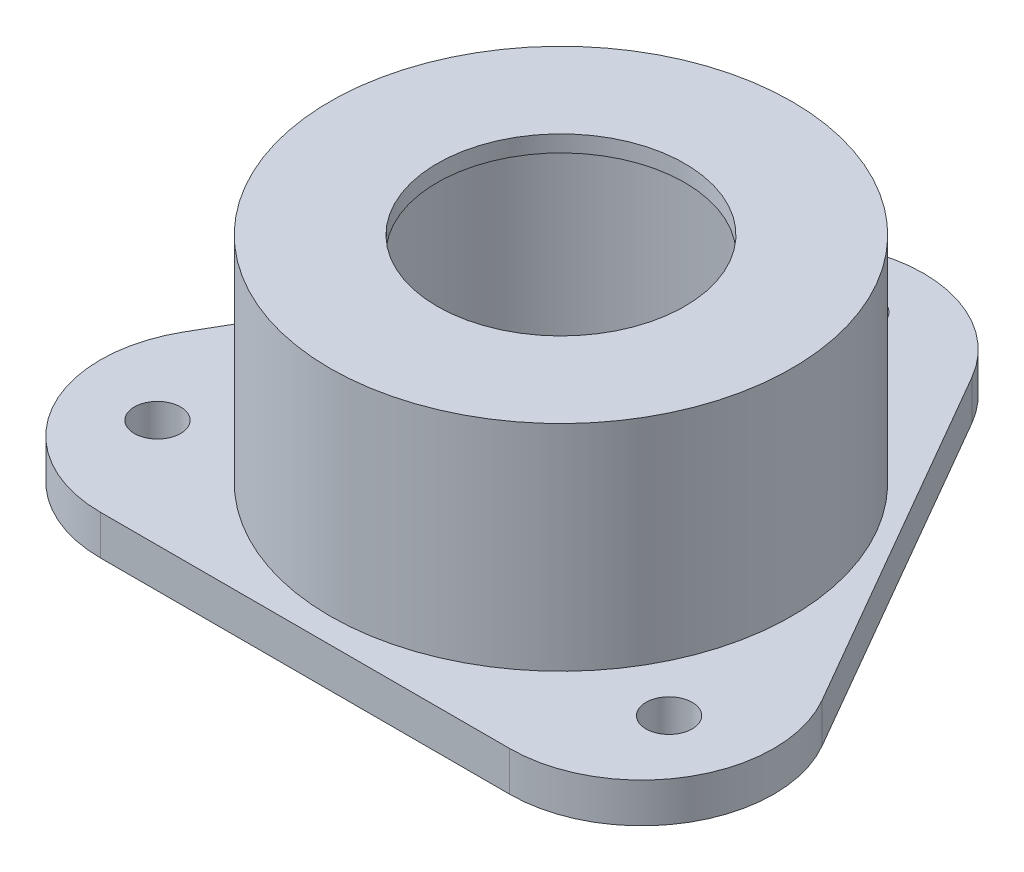
ISO-10303-21;
HEADER;
FILE_DESCRIPTION(('STEP AP214'),'2;1');
FILE_NAME('part.step','',(''),(''),'','','');
FILE_SCHEMA(('AUTOMOTIVE_DESIGN { 1 0 10303 214 1 1 1 1 }'));
ENDSEC;
DATA;
#1=APPLICATION_CONTEXT('core data for automotive mechanical design processes');
#2=APPLICATION_PROTOCOL_DEFINITION('international standard','automotive_design',2000,#1);
#3=PRODUCT_CONTEXT('',#1,'mechanical');
#4=PRODUCT('Part','Part','',(#3));
#5=PRODUCT_RELATED_PRODUCT_CATEGORY('part','',(#4));
#6=PRODUCT_DEFINITION_FORMATION('','',#4);
#7=PRODUCT_DEFINITION_CONTEXT('part definition',#1,'design');
#8=PRODUCT_DEFINITION('design','',#6,#7);
#9=PRODUCT_DEFINITION_SHAPE('','',#8);
#10=(LENGTH_UNIT() NAMED_UNIT(*) SI_UNIT(.MILLI.,.METRE.));
#11=(NAMED_UNIT(*) PLANE_ANGLE_UNIT() SI_UNIT($,.RADIAN.));
#12=(NAMED_UNIT(*) SI_UNIT($,.STERADIAN.) SOLID_ANGLE_UNIT());
#13=UNCERTAINTY_MEASURE_WITH_UNIT(LENGTH_MEASURE(1.E-05),#10,'distance_accuracy_value','');
#14=(GEOMETRIC_REPRESENTATION_CONTEXT(3) GLOBAL_UNCERTAINTY_ASSIGNED_CONTEXT((#13)) GLOBAL_UNIT_ASSIGNED_CONTEXT((#10,
#11,#12)) REPRESENTATION_CONTEXT('',''));
#15=CARTESIAN_POINT('',(0.,0.,0.));
#16=DIRECTION('',(0.,0.,1.));
#17=DIRECTION('',(1.,0.,0.));
#18=AXIS2_PLACEMENT_3D('',#15,#16,#17);
#19=CARTESIAN_POINT('',(32.0049681464521,-10.,4.75209437780733));
#20=DIRECTION('',(0.,1.,0.));
#21=DIRECTION('',(0.,0.,1.));
#22=AXIS2_PLACEMENT_3D('',#19,#20,#21);
#23=CYLINDRICAL_SURFACE('',#22,37.5);
#24=CARTESIAN_POINT('',(32.0049681464521,77.,4.75209437780733));
#25=DIRECTION('',(0.,1.,0.));
#26=DIRECTION('',(0.,0.,1.));
#27=AXIS2_PLACEMENT_3D('',#24,#25,#26);
#28=CIRCLE('',#27,37.5);
#29=CARTESIAN_POINT('',(32.0049681464521,77.,42.2520943778073));
#30=VERTEX_POINT('',#29);
#31=EDGE_CURVE('E148',#30,#30,#28,.T.);
#32=ORIENTED_EDGE('',*,*,#31,.T.);
#33=EDGE_LOOP('',(#32));
#34=FACE_BOUND('',#33,.T.);
#35=CARTESIAN_POINT('',(32.0049681464521,72.,4.75209437780733));
#36=DIRECTION('',(0.,-1.,0.));
#37=DIRECTION('',(0.,0.,-1.));
#38=AXIS2_PLACEMENT_3D('',#35,#36,#37);
#39=CIRCLE('',#38,37.5);
#40=CARTESIAN_POINT('',(32.0049681464521,72.,-32.7479056221927));
#41=VERTEX_POINT('',#40);
#42=EDGE_CURVE('E37',#41,#41,#39,.F.);
#43=ORIENTED_EDGE('',*,*,#42,.F.);
#44=EDGE_LOOP('',(#43));
#45=FACE_BOUND('',#44,.T.);
#46=ADVANCED_FACE('F33',(#34,#45),#23,.F.);
#47=CARTESIAN_POINT('',(32.0049681464521,12.,-65.104941493052));
#48=DIRECTION('',(0.,-1.,0.));
#49=DIRECTION('',(0.,0.,-1.));
#50=AXIS2_PLACEMENT_3D('',#47,#48,#49);
#51=CYLINDRICAL_SURFACE('',#50,40.);
#52=CARTESIAN_POINT('',(32.0049681464521,0.,-65.104941493052));
#53=DIRECTION('',(0.,1.,0.));
#54=DIRECTION('',(0.,0.,1.));
#55=AXIS2_PLACEMENT_3D('',#52,#53,#54);
#56=CIRCLE('',#55,40.);
#57=CARTESIAN_POINT('',(66.6459842978296,0.,-85.104941493052));
#58=VERTEX_POINT('',#57);
#59=CARTESIAN_POINT('',(-2.63604800492546,0.,-85.104941493052));
#60=VERTEX_POINT('',#59);
#61=EDGE_CURVE('E121',#58,#60,#56,.T.);
#62=ORIENTED_EDGE('',*,*,#61,.T.);
#63=DIRECTION('',(0.,-1.,0.));
#64=VECTOR('',#63,1.);
#65=CARTESIAN_POINT('',(-2.63604800492546,12.,-85.104941493052));
#66=LINE('',#65,#64);
#67=CARTESIAN_POINT('',(-2.63604800492546,12.,-85.104941493052));
#68=VERTEX_POINT('',#67);
#69=EDGE_CURVE('E43',#68,#60,#66,.T.);
#70=ORIENTED_EDGE('',*,*,#69,.F.);
#71=CARTESIAN_POINT('',(32.0049681464521,12.,-65.104941493052));
#72=DIRECTION('',(0.,1.,0.));
#73=DIRECTION('',(0.,0.,1.));
#74=AXIS2_PLACEMENT_3D('',#71,#72,#73);
#75=CIRCLE('',#74,40.);
#76=CARTESIAN_POINT('',(66.6459842978296,12.,-85.104941493052));
#77=VERTEX_POINT('',#76);
#78=EDGE_CURVE('E132',#77,#68,#75,.T.);
#79=ORIENTED_EDGE('',*,*,#78,.F.);
#80=DIRECTION('',(0.,-1.,0.));
#81=VECTOR('',#80,1.);
#82=CARTESIAN_POINT('',(66.6459842978296,12.,-85.104941493052));
#83=LINE('',#82,#81);
#84=EDGE_CURVE('E117',#77,#58,#83,.T.);
#85=ORIENTED_EDGE('',*,*,#84,.T.);
#86=EDGE_LOOP('',(#62,#70,#79,#85));
#87=FACE_BOUND('',#86,.T.);
#88=ADVANCED_FACE('F35',(#87),#51,.T.);
#89=CARTESIAN_POINT('',(-64.6340157021704,12.,22.2786885245903));
#90=DIRECTION('',(0.866025403784439,0.,0.5));
#91=DIRECTION('',(0.5,0.,-0.866025403784439));
#92=AXIS2_PLACEMENT_3D('',#89,#90,#91);
#93=PLANE('',#92);
#94=DIRECTION('',(-0.5,0.,0.866025403784439));
#95=VECTOR('',#94,1.);
#96=CARTESIAN_POINT('',(-64.6340157021704,0.,22.2786885245903));
#97=LINE('',#96,#95);
#98=CARTESIAN_POINT('',(-64.6340157021704,0.,22.2786885245903));
#99=VERTEX_POINT('',#98);
#100=EDGE_CURVE('E124',#60,#99,#97,.T.);
#101=ORIENTED_EDGE('',*,*,#100,.T.);
#102=DIRECTION('',(0.,-1.,0.));
#103=VECTOR('',#102,1.);
#104=CARTESIAN_POINT('',(-64.6340157021704,12.,22.2786885245903));
#105=LINE('',#104,#103);
#106=CARTESIAN_POINT('',(-64.6340157021704,12.,22.2786885245903));
#107=VERTEX_POINT('',#106);
#108=EDGE_CURVE('E136',#107,#99,#105,.T.);
#109=ORIENTED_EDGE('',*,*,#108,.F.);
#110=DIRECTION('',(-0.5,0.,0.866025403784439));
#111=VECTOR('',#110,1.);
#112=CARTESIAN_POINT('',(-64.6340157021704,12.,22.2786885245903));
#113=LINE('',#112,#111);
#114=EDGE_CURVE('E90',#68,#107,#113,.T.);
#115=ORIENTED_EDGE('',*,*,#114,.F.);
#116=ORIENTED_EDGE('',*,*,#69,.T.);
#117=EDGE_LOOP('',(#101,#109,#115,#116));
#118=FACE_BOUND('',#117,.T.);
#119=ADVANCED_FACE('F178',(#118),#93,.F.);
#120=CARTESIAN_POINT('',(-29.9929995507928,12.,42.2786885245903));
#121=DIRECTION('',(0.,-1.,0.));
#122=DIRECTION('',(0.,0.,-1.));
#123=AXIS2_PLACEMENT_3D('',#120,#121,#122);
#124=CYLINDRICAL_SURFACE('',#123,40.);
#125=CARTESIAN_POINT('',(-29.9929995507928,0.,42.2786885245903));
#126=DIRECTION('',(0.,1.,0.));
#127=DIRECTION('',(0.,0.,-1.));
#128=AXIS2_PLACEMENT_3D('',#125,#126,#127);
#129=CIRCLE('',#128,40.);
#130=CARTESIAN_POINT('',(-29.9929995507928,0.,82.2786885245903));
#131=VERTEX_POINT('',#130);
#132=EDGE_CURVE('E127',#99,#131,#129,.T.);
#133=ORIENTED_EDGE('',*,*,#132,.T.);
#134=DIRECTION('',(0.,-1.,0.));
#135=VECTOR('',#134,1.);
#136=CARTESIAN_POINT('',(-29.9929995507928,12.,82.2786885245903));
#137=LINE('',#136,#135);
#138=CARTESIAN_POINT('',(-29.9929995507928,12.,82.2786885245903));
#139=VERTEX_POINT('',#138);
#140=EDGE_CURVE('E112',#139,#131,#137,.T.);
#141=ORIENTED_EDGE('',*,*,#140,.F.);
#142=CARTESIAN_POINT('',(-29.9929995507928,12.,42.2786885245903));
#143=DIRECTION('',(0.,1.,0.));
#144=DIRECTION('',(0.,0.,-1.));
#145=AXIS2_PLACEMENT_3D('',#142,#143,#144);
#146=CIRCLE('',#145,40.);
#147=EDGE_CURVE('E103',#107,#139,#146,.T.);
#148=ORIENTED_EDGE('',*,*,#147,.F.);
#149=ORIENTED_EDGE('',*,*,#108,.T.);
#150=EDGE_LOOP('',(#133,#141,#148,#149));
#151=FACE_BOUND('',#150,.T.);
#152=ADVANCED_FACE('F181',(#151),#124,.T.);
#153=CARTESIAN_POINT('',(94.002935843697,12.,82.2786885245903));
#154=DIRECTION('',(0.,0.,-1.));
#155=DIRECTION('',(-1.,0.,0.));
#156=AXIS2_PLACEMENT_3D('',#153,#154,#155);
#157=PLANE('',#156);
#158=DIRECTION('',(1.,0.,0.));
#159=VECTOR('',#158,1.);
#160=CARTESIAN_POINT('',(94.002935843697,0.,82.2786885245903));
#161=LINE('',#160,#159);
#162=CARTESIAN_POINT('',(94.002935843697,0.,82.2786885245903));
#163=VERTEX_POINT('',#162);
#164=EDGE_CURVE('E111',#131,#163,#161,.T.);
#165=ORIENTED_EDGE('',*,*,#164,.T.);
#166=DIRECTION('',(0.,-1.,0.));
#167=VECTOR('',#166,1.);
#168=CARTESIAN_POINT('',(94.002935843697,12.,82.2786885245903));
#169=LINE('',#168,#167);
#170=CARTESIAN_POINT('',(94.002935843697,12.,82.2786885245903));
#171=VERTEX_POINT('',#170);
#172=EDGE_CURVE('E108',#171,#163,#169,.T.);
#173=ORIENTED_EDGE('',*,*,#172,.F.);
#174=DIRECTION('',(1.,0.,0.));
#175=VECTOR('',#174,1.);
#176=CARTESIAN_POINT('',(94.002935843697,12.,82.2786885245903));
#177=LINE('',#176,#175);
#178=EDGE_CURVE('E97',#139,#171,#177,.T.);
#179=ORIENTED_EDGE('',*,*,#178,.F.);
#180=ORIENTED_EDGE('',*,*,#140,.T.);
#181=EDGE_LOOP('',(#165,#173,#179,#180));
#182=FACE_BOUND('',#181,.T.);
#183=ADVANCED_FACE('F109',(#182),#157,.F.);
#184=CARTESIAN_POINT('',(94.002935843697,12.,42.2786885245902));
#185=DIRECTION('',(0.,-1.,0.));
#186=DIRECTION('',(0.,0.,-1.));
#187=AXIS2_PLACEMENT_3D('',#184,#185,#186);
#188=CYLINDRICAL_SURFACE('',#187,40.);
#189=CARTESIAN_POINT('',(94.002935843697,0.,42.2786885245902));
#190=DIRECTION('',(0.,1.,0.));
#191=DIRECTION('',(0.,0.,-1.));
#192=AXIS2_PLACEMENT_3D('',#189,#190,#191);
#193=CIRCLE('',#192,40.);
#194=CARTESIAN_POINT('',(128.643951995075,0.,22.2786885245902));
#195=VERTEX_POINT('',#194);
#196=EDGE_CURVE('E75',#163,#195,#193,.T.);
#197=ORIENTED_EDGE('',*,*,#196,.T.);
#198=DIRECTION('',(0.,-1.,0.));
#199=VECTOR('',#198,1.);
#200=CARTESIAN_POINT('',(128.643951995075,12.,22.2786885245902));
#201=LINE('',#200,#199);
#202=CARTESIAN_POINT('',(128.643951995075,12.,22.2786885245902));
#203=VERTEX_POINT('',#202);
#204=EDGE_CURVE('E113',#203,#195,#201,.T.);
#205=ORIENTED_EDGE('',*,*,#204,.F.);
#206=CARTESIAN_POINT('',(94.002935843697,12.,42.2786885245902));
#207=DIRECTION('',(0.,1.,0.));
#208=DIRECTION('',(0.,0.,-1.));
#209=AXIS2_PLACEMENT_3D('',#206,#207,#208);
#210=CIRCLE('',#209,40.);
#211=EDGE_CURVE('E101',#171,#203,#210,.T.);
#212=ORIENTED_EDGE('',*,*,#211,.F.);
#213=ORIENTED_EDGE('',*,*,#172,.T.);
#214=EDGE_LOOP('',(#197,#205,#212,#213));
#215=FACE_BOUND('',#214,.T.);
#216=ADVANCED_FACE('F115',(#215),#188,.T.);
#217=CARTESIAN_POINT('',(66.6459842978296,12.,-85.104941493052));
#218=DIRECTION('',(-0.866025403784439,0.,0.5));
#219=DIRECTION('',(0.5,0.,0.866025403784439));
#220=AXIS2_PLACEMENT_3D('',#217,#218,#219);
#221=PLANE('',#220);
#222=DIRECTION('',(-0.5,0.,-0.866025403784439));
#223=VECTOR('',#222,1.);
#224=CARTESIAN_POINT('',(66.6459842978296,0.,-85.104941493052));
#225=LINE('',#224,#223);
#226=EDGE_CURVE('E81',#195,#58,#225,.T.);
#227=ORIENTED_EDGE('',*,*,#226,.T.);
#228=ORIENTED_EDGE('',*,*,#84,.F.);
#229=DIRECTION('',(-0.5,0.,-0.866025403784439));
#230=VECTOR('',#229,1.);
#231=CARTESIAN_POINT('',(66.6459842978296,12.,-85.104941493052));
#232=LINE('',#231,#230);
#233=EDGE_CURVE('E52',#203,#77,#232,.T.);
#234=ORIENTED_EDGE('',*,*,#233,.F.);
#235=ORIENTED_EDGE('',*,*,#204,.T.);
#236=EDGE_LOOP('',(#227,#228,#234,#235));
#237=FACE_BOUND('',#236,.T.);
#238=ADVANCED_FACE('F186',(#237),#221,.F.);
#239=CARTESIAN_POINT('',(32.0049681464521,12.,-65.104941493052));
#240=DIRECTION('',(0.,1.,0.));
#241=DIRECTION('',(0.,0.,1.));
#242=AXIS2_PLACEMENT_3D('',#239,#240,#241);
#243=PLANE('',#242);
#244=CARTESIAN_POINT('',(32.0049681464521,12.,4.75209437780733));
#245=DIRECTION('',(0.,1.,0.));
#246=DIRECTION('',(0.,0.,1.));
#247=AXIS2_PLACEMENT_3D('',#244,#245,#246);
#248=CIRCLE('',#247,70.);
#249=CARTESIAN_POINT('',(32.0049681464521,12.,74.7520943778074));
#250=VERTEX_POINT('',#249);
#251=EDGE_CURVE('E11',#250,#250,#248,.T.);
#252=ORIENTED_EDGE('',*,*,#251,.F.);
#253=EDGE_LOOP('',(#252));
#254=FACE_BOUND('',#253,.T.);
#255=CARTESIAN_POINT('',(109.504968146452,12.,49.4967402400033));
#256=DIRECTION('',(0.,1.,0.));
#257=DIRECTION('',(0.,0.,1.));
#258=AXIS2_PLACEMENT_3D('',#255,#256,#257);
#259=CIRCLE('',#258,7.);
#260=CARTESIAN_POINT('',(109.504968146452,12.,56.4967402400033));
#261=VERTEX_POINT('',#260);
#262=EDGE_CURVE('E144',#261,#261,#259,.T.);
#263=ORIENTED_EDGE('',*,*,#262,.F.);
#264=EDGE_LOOP('',(#263));
#265=FACE_BOUND('',#264,.T.);
#266=CARTESIAN_POINT('',(32.0049681464521,12.,-84.7371973465846));
#267=DIRECTION('',(0.,1.,0.));
#268=DIRECTION('',(0.,0.,1.));
#269=AXIS2_PLACEMENT_3D('',#266,#267,#268);
#270=CIRCLE('',#269,7.);
#271=CARTESIAN_POINT('',(32.0049681464521,12.,-77.7371973465846));
#272=VERTEX_POINT('',#271);
#273=EDGE_CURVE('E170',#272,#272,#270,.T.);
#274=ORIENTED_EDGE('',*,*,#273,.F.);
#275=EDGE_LOOP('',(#274));
#276=FACE_BOUND('',#275,.T.);
#277=CARTESIAN_POINT('',(-45.4950318535479,12.,49.4967402400033));
#278=DIRECTION('',(0.,1.,0.));
#279=DIRECTION('',(0.,0.,1.));
#280=AXIS2_PLACEMENT_3D('',#277,#278,#279);
#281=CIRCLE('',#280,7.);
#282=CARTESIAN_POINT('',(-45.4950318535479,12.,56.4967402400033));
#283=VERTEX_POINT('',#282);
#284=EDGE_CURVE('E154',#283,#283,#281,.T.);
#285=ORIENTED_EDGE('',*,*,#284,.F.);
#286=EDGE_LOOP('',(#285));
#287=FACE_BOUND('',#286,.T.);
#288=ORIENTED_EDGE('',*,*,#78,.T.);
#289=ORIENTED_EDGE('',*,*,#114,.T.);
#290=ORIENTED_EDGE('',*,*,#147,.T.);
#291=ORIENTED_EDGE('',*,*,#178,.T.);
#292=ORIENTED_EDGE('',*,*,#211,.T.);
#293=ORIENTED_EDGE('',*,*,#233,.T.);
#294=EDGE_LOOP('',(#288,#289,#290,#291,#292,#293));
#295=FACE_BOUND('',#294,.T.);
#296=ADVANCED_FACE('F99',(#254,#265,#276,#287,#295),#243,.T.);
#297=CARTESIAN_POINT('',(32.0049681464521,0.,-65.104941493052));
#298=DIRECTION('',(0.,1.,0.));
#299=DIRECTION('',(0.,0.,1.));
#300=AXIS2_PLACEMENT_3D('',#297,#298,#299);
#301=PLANE('',#300);
#302=CARTESIAN_POINT('',(32.0049681464521,0.,4.75209437780733));
#303=DIRECTION('',(0.,-1.,0.));
#304=DIRECTION('',(0.,0.,-1.));
#305=AXIS2_PLACEMENT_3D('',#302,#303,#304);
#306=CIRCLE('',#305,55.);
#307=CARTESIAN_POINT('',(32.0049681464521,0.,-50.2479056221927));
#308=VERTEX_POINT('',#307);
#309=EDGE_CURVE('E161',#308,#308,#306,.T.);
#310=ORIENTED_EDGE('',*,*,#309,.F.);
#311=EDGE_LOOP('',(#310));
#312=FACE_BOUND('',#311,.T.);
#313=CARTESIAN_POINT('',(109.504968146452,0.,49.4967402400033));
#314=DIRECTION('',(0.,1.,0.));
#315=DIRECTION('',(0.,0.,1.));
#316=AXIS2_PLACEMENT_3D('',#313,#314,#315);
#317=CIRCLE('',#316,7.);
#318=CARTESIAN_POINT('',(109.504968146452,0.,56.4967402400033));
#319=VERTEX_POINT('',#318);
#320=EDGE_CURVE('E125',#319,#319,#317,.T.);
#321=ORIENTED_EDGE('',*,*,#320,.T.);
#322=EDGE_LOOP('',(#321));
#323=FACE_BOUND('',#322,.T.);
#324=CARTESIAN_POINT('',(32.0049681464521,0.,-84.7371973465846));
#325=DIRECTION('',(0.,1.,0.));
#326=DIRECTION('',(0.,0.,1.));
#327=AXIS2_PLACEMENT_3D('',#324,#325,#326);
#328=CIRCLE('',#327,7.);
#329=CARTESIAN_POINT('',(32.0049681464521,0.,-77.7371973465846));
#330=VERTEX_POINT('',#329);
#331=EDGE_CURVE('E143',#330,#330,#328,.T.);
#332=ORIENTED_EDGE('',*,*,#331,.T.);
#333=EDGE_LOOP('',(#332));
#334=FACE_BOUND('',#333,.T.);
#335=CARTESIAN_POINT('',(-45.4950318535479,0.,49.4967402400033));
#336=DIRECTION('',(0.,1.,0.));
#337=DIRECTION('',(0.,0.,1.));
#338=AXIS2_PLACEMENT_3D('',#335,#336,#337);
#339=CIRCLE('',#338,7.);
#340=CARTESIAN_POINT('',(-45.4950318535479,0.,56.4967402400033));
#341=VERTEX_POINT('',#340);
#342=EDGE_CURVE('E140',#341,#341,#339,.T.);
#343=ORIENTED_EDGE('',*,*,#342,.T.);
#344=EDGE_LOOP('',(#343));
#345=FACE_BOUND('',#344,.T.);
#346=ORIENTED_EDGE('',*,*,#61,.F.);
#347=ORIENTED_EDGE('',*,*,#226,.F.);
#348=ORIENTED_EDGE('',*,*,#196,.F.);
#349=ORIENTED_EDGE('',*,*,#164,.F.);
#350=ORIENTED_EDGE('',*,*,#132,.F.);
#351=ORIENTED_EDGE('',*,*,#100,.F.);
#352=EDGE_LOOP('',(#346,#347,#348,#349,#350,#351));
#353=FACE_BOUND('',#352,.T.);
#354=ADVANCED_FACE('F184',(#312,#323,#334,#345,#353),#301,.F.);
#355=CARTESIAN_POINT('',(-45.4950318535479,-10.,49.4967402400033));
#356=DIRECTION('',(0.,1.,0.));
#357=DIRECTION('',(0.,0.,1.));
#358=AXIS2_PLACEMENT_3D('',#355,#356,#357);
#359=CYLINDRICAL_SURFACE('',#358,7.);
#360=ORIENTED_EDGE('',*,*,#284,.T.);
#361=EDGE_LOOP('',(#360));
#362=FACE_BOUND('',#361,.T.);
#363=ORIENTED_EDGE('',*,*,#342,.F.);
#364=EDGE_LOOP('',(#363));
#365=FACE_BOUND('',#364,.T.);
#366=ADVANCED_FACE('F204',(#362,#365),#359,.F.);
#367=CARTESIAN_POINT('',(32.0049681464521,-10.,-84.7371973465846));
#368=DIRECTION('',(0.,1.,0.));
#369=DIRECTION('',(0.,0.,1.));
#370=AXIS2_PLACEMENT_3D('',#367,#368,#369);
#371=CYLINDRICAL_SURFACE('',#370,7.);
#372=ORIENTED_EDGE('',*,*,#273,.T.);
#373=EDGE_LOOP('',(#372));
#374=FACE_BOUND('',#373,.T.);
#375=ORIENTED_EDGE('',*,*,#331,.F.);
#376=EDGE_LOOP('',(#375));
#377=FACE_BOUND('',#376,.T.);
#378=ADVANCED_FACE('F211',(#374,#377),#371,.F.);
#379=CARTESIAN_POINT('',(109.504968146452,-10.,49.4967402400033));
#380=DIRECTION('',(0.,1.,0.));
#381=DIRECTION('',(0.,0.,1.));
#382=AXIS2_PLACEMENT_3D('',#379,#380,#381);
#383=CYLINDRICAL_SURFACE('',#382,7.);
#384=ORIENTED_EDGE('',*,*,#262,.T.);
#385=EDGE_LOOP('',(#384));
#386=FACE_BOUND('',#385,.T.);
#387=ORIENTED_EDGE('',*,*,#320,.F.);
#388=EDGE_LOOP('',(#387));
#389=FACE_BOUND('',#388,.T.);
#390=ADVANCED_FACE('F223',(#386,#389),#383,.F.);
#391=CARTESIAN_POINT('',(32.0049681464521,77.,4.75209437780733));
#392=DIRECTION('',(0.,1.,0.));
#393=DIRECTION('',(0.,0.,1.));
#394=AXIS2_PLACEMENT_3D('',#391,#392,#393);
#395=PLANE('',#394);
#396=ORIENTED_EDGE('',*,*,#31,.F.);
#397=EDGE_LOOP('',(#396));
#398=FACE_BOUND('',#397,.T.);
#399=CARTESIAN_POINT('',(32.0049681464521,77.,4.75209437780733));
#400=DIRECTION('',(0.,1.,0.));
#401=DIRECTION('',(0.,0.,1.));
#402=AXIS2_PLACEMENT_3D('',#399,#400,#401);
#403=CIRCLE('',#402,70.);
#404=CARTESIAN_POINT('',(32.0049681464521,77.,74.7520943778074));
#405=VERTEX_POINT('',#404);
#406=EDGE_CURVE('E150',#405,#405,#403,.T.);
#407=ORIENTED_EDGE('',*,*,#406,.T.);
#408=EDGE_LOOP('',(#407));
#409=FACE_BOUND('',#408,.T.);
#410=ADVANCED_FACE('F228',(#398,#409),#395,.T.);
#411=CARTESIAN_POINT('',(32.0049681464521,77.,4.75209437780733));
#412=DIRECTION('',(0.,-1.,0.));
#413=DIRECTION('',(0.,0.,-1.));
#414=AXIS2_PLACEMENT_3D('',#411,#412,#413);
#415=CYLINDRICAL_SURFACE('',#414,70.);
#416=ORIENTED_EDGE('',*,*,#406,.F.);
#417=EDGE_LOOP('',(#416));
#418=FACE_BOUND('',#417,.T.);
#419=ORIENTED_EDGE('',*,*,#251,.T.);
#420=EDGE_LOOP('',(#419));
#421=FACE_BOUND('',#420,.T.);
#422=ADVANCED_FACE('F232',(#418,#421),#415,.T.);
#423=CARTESIAN_POINT('',(32.0049681464521,72.,4.75209437780733));
#424=DIRECTION('',(0.,-1.,0.));
#425=DIRECTION('',(0.,0.,-1.));
#426=AXIS2_PLACEMENT_3D('',#423,#424,#425);
#427=PLANE('',#426);
#428=CARTESIAN_POINT('',(32.0049681464521,72.,4.75209437780733));
#429=DIRECTION('',(0.,-1.,0.));
#430=DIRECTION('',(0.,0.,-1.));
#431=AXIS2_PLACEMENT_3D('',#428,#429,#430);
#432=CIRCLE('',#431,55.);
#433=CARTESIAN_POINT('',(32.0049681464521,72.,-50.2479056221927));
#434=VERTEX_POINT('',#433);
#435=EDGE_CURVE('E157',#434,#434,#432,.T.);
#436=ORIENTED_EDGE('',*,*,#435,.T.);
#437=EDGE_LOOP('',(#436));
#438=FACE_BOUND('',#437,.T.);
#439=ORIENTED_EDGE('',*,*,#42,.T.);
#440=EDGE_LOOP('',(#439));
#441=FACE_BOUND('',#440,.T.);
#442=ADVANCED_FACE('F235',(#438,#441),#427,.T.);
#443=CARTESIAN_POINT('',(32.0049681464521,72.,4.75209437780733));
#444=DIRECTION('',(0.,-1.,0.));
#445=DIRECTION('',(0.,0.,-1.));
#446=AXIS2_PLACEMENT_3D('',#443,#444,#445);
#447=CYLINDRICAL_SURFACE('',#446,55.);
#448=ORIENTED_EDGE('',*,*,#435,.F.);
#449=EDGE_LOOP('',(#448));
#450=FACE_BOUND('',#449,.T.);
#451=ORIENTED_EDGE('',*,*,#309,.T.);
#452=EDGE_LOOP('',(#451));
#453=FACE_BOUND('',#452,.T.);
#454=ADVANCED_FACE('F240',(#450,#453),#447,.F.);
#455=CLOSED_SHELL('',(#46,#88,#119,#152,#183,#216,#238,#296,#354,#366,#378,#390,#410,#422,#442,#454));
#456=MANIFOLD_SOLID_BREP('B2',#455);
#457=ADVANCED_BREP_SHAPE_REPRESENTATION('',(#18,#456),#14);
#458=SHAPE_DEFINITION_REPRESENTATION(#9,#457);
ENDSEC;
END-ISO-10303-21;
